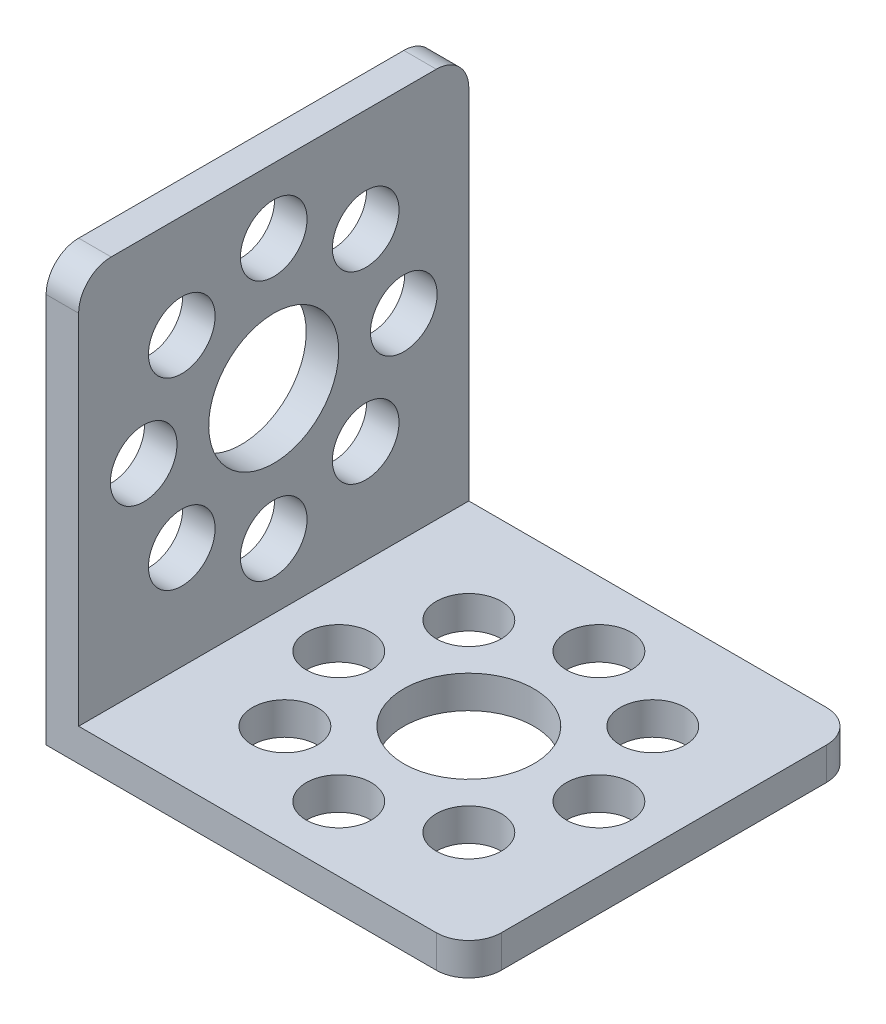
ISO-10303-21;
HEADER;
FILE_DESCRIPTION(('STEP AP214'),'2;1');
FILE_NAME('part.step','',(''),(''),'','','');
FILE_SCHEMA(('AUTOMOTIVE_DESIGN { 1 0 10303 214 1 1 1 1 }'));
ENDSEC;
DATA;
#1=APPLICATION_CONTEXT('core data for automotive mechanical design processes');
#2=APPLICATION_PROTOCOL_DEFINITION('international standard','automotive_design',2000,#1);
#3=PRODUCT_CONTEXT('',#1,'mechanical');
#4=PRODUCT('Part','Part','',(#3));
#5=PRODUCT_RELATED_PRODUCT_CATEGORY('part','',(#4));
#6=PRODUCT_DEFINITION_FORMATION('','',#4);
#7=PRODUCT_DEFINITION_CONTEXT('part definition',#1,'design');
#8=PRODUCT_DEFINITION('design','',#6,#7);
#9=PRODUCT_DEFINITION_SHAPE('','',#8);
#10=(LENGTH_UNIT() NAMED_UNIT(*) SI_UNIT(.MILLI.,.METRE.));
#11=(NAMED_UNIT(*) PLANE_ANGLE_UNIT() SI_UNIT($,.RADIAN.));
#12=(NAMED_UNIT(*) SI_UNIT($,.STERADIAN.) SOLID_ANGLE_UNIT());
#13=UNCERTAINTY_MEASURE_WITH_UNIT(LENGTH_MEASURE(1.E-05),#10,'distance_accuracy_value','');
#14=(GEOMETRIC_REPRESENTATION_CONTEXT(3) GLOBAL_UNCERTAINTY_ASSIGNED_CONTEXT((#13)) GLOBAL_UNIT_ASSIGNED_CONTEXT((#10,
#11,#12)) REPRESENTATION_CONTEXT('',''));
#15=CARTESIAN_POINT('',(0.,0.,0.));
#16=DIRECTION('',(0.,0.,1.));
#17=DIRECTION('',(1.,0.,0.));
#18=AXIS2_PLACEMENT_3D('',#15,#16,#17);
#19=CARTESIAN_POINT('',(26.,0.,24.));
#20=DIRECTION('',(0.,1.,0.));
#21=DIRECTION('',(-1.,0.,0.));
#22=AXIS2_PLACEMENT_3D('',#19,#20,#21);
#23=PLANE('',#22);
#24=CARTESIAN_POINT('',(19.6568542494924,0.,6.34314575050769));
#25=DIRECTION('',(0.,1.,0.));
#26=DIRECTION('',(0.,0.,1.));
#27=AXIS2_PLACEMENT_3D('',#24,#25,#26);
#28=CIRCLE('',#27,2.);
#29=CARTESIAN_POINT('',(19.6568542494924,0.,8.34314575050769));
#30=VERTEX_POINT('',#29);
#31=EDGE_CURVE('E345',#30,#30,#28,.T.);
#32=ORIENTED_EDGE('',*,*,#31,.T.);
#33=EDGE_LOOP('',(#32));
#34=FACE_BOUND('',#33,.T.);
#35=CARTESIAN_POINT('',(14.0000000000001,0.,4.));
#36=DIRECTION('',(0.,1.,0.));
#37=DIRECTION('',(0.,0.,1.));
#38=AXIS2_PLACEMENT_3D('',#35,#36,#37);
#39=CIRCLE('',#38,2.);
#40=CARTESIAN_POINT('',(14.0000000000001,0.,6.));
#41=VERTEX_POINT('',#40);
#42=EDGE_CURVE('E339',#41,#41,#39,.T.);
#43=ORIENTED_EDGE('',*,*,#42,.T.);
#44=EDGE_LOOP('',(#43));
#45=FACE_BOUND('',#44,.T.);
#46=CARTESIAN_POINT('',(8.34314575050767,0.,6.34314575050757));
#47=DIRECTION('',(0.,1.,0.));
#48=DIRECTION('',(0.,0.,1.));
#49=AXIS2_PLACEMENT_3D('',#46,#47,#48);
#50=CIRCLE('',#49,2.);
#51=CARTESIAN_POINT('',(8.34314575050767,0.,8.34314575050757));
#52=VERTEX_POINT('',#51);
#53=EDGE_CURVE('E329',#52,#52,#50,.T.);
#54=ORIENTED_EDGE('',*,*,#53,.T.);
#55=EDGE_LOOP('',(#54));
#56=FACE_BOUND('',#55,.T.);
#57=CARTESIAN_POINT('',(6.,0.,12.));
#58=DIRECTION('',(0.,1.,0.));
#59=DIRECTION('',(0.,0.,1.));
#60=AXIS2_PLACEMENT_3D('',#57,#58,#59);
#61=CIRCLE('',#60,1.99999999999998);
#62=CARTESIAN_POINT('',(6.,0.,14.));
#63=VERTEX_POINT('',#62);
#64=EDGE_CURVE('E324',#63,#63,#61,.T.);
#65=ORIENTED_EDGE('',*,*,#64,.T.);
#66=EDGE_LOOP('',(#65));
#67=FACE_BOUND('',#66,.T.);
#68=CARTESIAN_POINT('',(8.34314575050759,0.,17.6568542494923));
#69=DIRECTION('',(0.,1.,0.));
#70=DIRECTION('',(0.,0.,1.));
#71=AXIS2_PLACEMENT_3D('',#68,#69,#70);
#72=CIRCLE('',#71,2.);
#73=CARTESIAN_POINT('',(8.34314575050759,0.,19.6568542494923));
#74=VERTEX_POINT('',#73);
#75=EDGE_CURVE('E369',#74,#74,#72,.T.);
#76=ORIENTED_EDGE('',*,*,#75,.T.);
#77=EDGE_LOOP('',(#76));
#78=FACE_BOUND('',#77,.T.);
#79=CARTESIAN_POINT('',(14.,0.,20.));
#80=DIRECTION('',(0.,1.,0.));
#81=DIRECTION('',(0.,0.,1.));
#82=AXIS2_PLACEMENT_3D('',#79,#80,#81);
#83=CIRCLE('',#82,2.);
#84=CARTESIAN_POINT('',(14.,0.,22.));
#85=VERTEX_POINT('',#84);
#86=EDGE_CURVE('E363',#85,#85,#83,.T.);
#87=ORIENTED_EDGE('',*,*,#86,.T.);
#88=EDGE_LOOP('',(#87));
#89=FACE_BOUND('',#88,.T.);
#90=CARTESIAN_POINT('',(19.6568542494924,0.,17.6568542494924));
#91=DIRECTION('',(0.,1.,0.));
#92=DIRECTION('',(0.,0.,1.));
#93=AXIS2_PLACEMENT_3D('',#90,#91,#92);
#94=CIRCLE('',#93,2.);
#95=CARTESIAN_POINT('',(19.6568542494924,0.,19.6568542494924));
#96=VERTEX_POINT('',#95);
#97=EDGE_CURVE('E357',#96,#96,#94,.T.);
#98=ORIENTED_EDGE('',*,*,#97,.T.);
#99=EDGE_LOOP('',(#98));
#100=FACE_BOUND('',#99,.T.);
#101=CARTESIAN_POINT('',(22.,0.,12.));
#102=DIRECTION('',(0.,1.,0.));
#103=DIRECTION('',(0.,0.,1.));
#104=AXIS2_PLACEMENT_3D('',#101,#102,#103);
#105=CIRCLE('',#104,2.);
#106=CARTESIAN_POINT('',(22.,0.,14.));
#107=VERTEX_POINT('',#106);
#108=EDGE_CURVE('E350',#107,#107,#105,.T.);
#109=ORIENTED_EDGE('',*,*,#108,.T.);
#110=EDGE_LOOP('',(#109));
#111=FACE_BOUND('',#110,.T.);
#112=CARTESIAN_POINT('',(14.,0.,12.));
#113=DIRECTION('',(0.,1.,0.));
#114=DIRECTION('',(0.,0.,1.));
#115=AXIS2_PLACEMENT_3D('',#112,#113,#114);
#116=CIRCLE('',#115,4.);
#117=CARTESIAN_POINT('',(14.,0.,16.));
#118=VERTEX_POINT('',#117);
#119=EDGE_CURVE('E374',#118,#118,#116,.T.);
#120=ORIENTED_EDGE('',*,*,#119,.T.);
#121=EDGE_LOOP('',(#120));
#122=FACE_BOUND('',#121,.T.);
#123=DIRECTION('',(1.,0.,0.));
#124=VECTOR('',#123,1.);
#125=CARTESIAN_POINT('',(26.,0.,0.));
#126=LINE('',#125,#124);
#127=CARTESIAN_POINT('',(0.,0.,0.));
#128=VERTEX_POINT('',#127);
#129=CARTESIAN_POINT('',(24.,0.,0.));
#130=VERTEX_POINT('',#129);
#131=EDGE_CURVE('E146',#128,#130,#126,.T.);
#132=ORIENTED_EDGE('',*,*,#131,.T.);
#133=CARTESIAN_POINT('',(24.,0.,2.));
#134=DIRECTION('',(0.,1.,0.));
#135=DIRECTION('',(-1.,0.,0.));
#136=AXIS2_PLACEMENT_3D('',#133,#134,#135);
#137=CIRCLE('',#136,2.);
#138=CARTESIAN_POINT('',(26.,0.,2.));
#139=VERTEX_POINT('',#138);
#140=EDGE_CURVE('E11',#130,#139,#137,.F.);
#141=ORIENTED_EDGE('',*,*,#140,.T.);
#142=DIRECTION('',(0.,0.,-1.));
#143=VECTOR('',#142,1.);
#144=CARTESIAN_POINT('',(26.,0.,24.));
#145=LINE('',#144,#143);
#146=CARTESIAN_POINT('',(26.,0.,22.));
#147=VERTEX_POINT('',#146);
#148=EDGE_CURVE('E162',#147,#139,#145,.T.);
#149=ORIENTED_EDGE('',*,*,#148,.F.);
#150=CARTESIAN_POINT('',(24.,0.,22.));
#151=DIRECTION('',(0.,1.,0.));
#152=DIRECTION('',(-1.,0.,0.));
#153=AXIS2_PLACEMENT_3D('',#150,#151,#152);
#154=CIRCLE('',#153,2.);
#155=CARTESIAN_POINT('',(24.,0.,24.));
#156=VERTEX_POINT('',#155);
#157=EDGE_CURVE('E41',#147,#156,#154,.F.);
#158=ORIENTED_EDGE('',*,*,#157,.T.);
#159=DIRECTION('',(1.,0.,0.));
#160=VECTOR('',#159,1.);
#161=CARTESIAN_POINT('',(26.,0.,24.));
#162=LINE('',#161,#160);
#163=CARTESIAN_POINT('',(0.,0.,24.));
#164=VERTEX_POINT('',#163);
#165=EDGE_CURVE('E122',#164,#156,#162,.T.);
#166=ORIENTED_EDGE('',*,*,#165,.F.);
#167=DIRECTION('',(0.,0.,-1.));
#168=VECTOR('',#167,1.);
#169=CARTESIAN_POINT('',(0.,0.,24.));
#170=LINE('',#169,#168);
#171=EDGE_CURVE('E142',#164,#128,#170,.T.);
#172=ORIENTED_EDGE('',*,*,#171,.T.);
#173=EDGE_LOOP('',(#132,#141,#149,#158,#166,#172));
#174=FACE_BOUND('',#173,.T.);
#175=ADVANCED_FACE('F33',(#34,#45,#56,#67,#78,#89,#100,#111,#122,#174),#23,.F.);
#176=CARTESIAN_POINT('',(26.,2.,24.));
#177=DIRECTION('',(-1.,0.,0.));
#178=DIRECTION('',(0.,0.,1.));
#179=AXIS2_PLACEMENT_3D('',#176,#177,#178);
#180=PLANE('',#179);
#181=ORIENTED_EDGE('',*,*,#148,.T.);
#182=DIRECTION('',(0.,1.,0.));
#183=VECTOR('',#182,1.);
#184=CARTESIAN_POINT('',(26.,2.,2.));
#185=LINE('',#184,#183);
#186=CARTESIAN_POINT('',(26.,2.,2.));
#187=VERTEX_POINT('',#186);
#188=EDGE_CURVE('E184',#139,#187,#185,.T.);
#189=ORIENTED_EDGE('',*,*,#188,.T.);
#190=DIRECTION('',(0.,0.,-1.));
#191=VECTOR('',#190,1.);
#192=CARTESIAN_POINT('',(26.,2.,24.));
#193=LINE('',#192,#191);
#194=CARTESIAN_POINT('',(26.,2.,22.));
#195=VERTEX_POINT('',#194);
#196=EDGE_CURVE('E133',#195,#187,#193,.T.);
#197=ORIENTED_EDGE('',*,*,#196,.F.);
#198=DIRECTION('',(0.,1.,0.));
#199=VECTOR('',#198,1.);
#200=CARTESIAN_POINT('',(26.,2.,22.));
#201=LINE('',#200,#199);
#202=EDGE_CURVE('E53',#195,#147,#201,.F.);
#203=ORIENTED_EDGE('',*,*,#202,.T.);
#204=EDGE_LOOP('',(#181,#189,#197,#203));
#205=FACE_BOUND('',#204,.T.);
#206=ADVANCED_FACE('F195',(#205),#180,.F.);
#207=CARTESIAN_POINT('',(2.,2.,24.));
#208=DIRECTION('',(0.,-1.,0.));
#209=DIRECTION('',(0.,0.,-1.));
#210=AXIS2_PLACEMENT_3D('',#207,#208,#209);
#211=PLANE('',#210);
#212=CARTESIAN_POINT('',(19.6568542494924,2.,6.34314575050769));
#213=DIRECTION('',(0.,1.,0.));
#214=DIRECTION('',(0.,0.,1.));
#215=AXIS2_PLACEMENT_3D('',#212,#213,#214);
#216=CIRCLE('',#215,2.);
#217=CARTESIAN_POINT('',(19.6568542494924,2.,8.34314575050769));
#218=VERTEX_POINT('',#217);
#219=EDGE_CURVE('E347',#218,#218,#216,.T.);
#220=ORIENTED_EDGE('',*,*,#219,.F.);
#221=EDGE_LOOP('',(#220));
#222=FACE_BOUND('',#221,.T.);
#223=CARTESIAN_POINT('',(14.0000000000001,2.,4.));
#224=DIRECTION('',(0.,1.,0.));
#225=DIRECTION('',(0.,0.,1.));
#226=AXIS2_PLACEMENT_3D('',#223,#224,#225);
#227=CIRCLE('',#226,2.);
#228=CARTESIAN_POINT('',(14.0000000000001,2.,6.));
#229=VERTEX_POINT('',#228);
#230=EDGE_CURVE('E342',#229,#229,#227,.T.);
#231=ORIENTED_EDGE('',*,*,#230,.F.);
#232=EDGE_LOOP('',(#231));
#233=FACE_BOUND('',#232,.T.);
#234=CARTESIAN_POINT('',(8.34314575050767,2.,6.34314575050757));
#235=DIRECTION('',(0.,1.,0.));
#236=DIRECTION('',(0.,0.,1.));
#237=AXIS2_PLACEMENT_3D('',#234,#235,#236);
#238=CIRCLE('',#237,2.);
#239=CARTESIAN_POINT('',(8.34314575050767,2.,8.34314575050757));
#240=VERTEX_POINT('',#239);
#241=EDGE_CURVE('E334',#240,#240,#238,.T.);
#242=ORIENTED_EDGE('',*,*,#241,.F.);
#243=EDGE_LOOP('',(#242));
#244=FACE_BOUND('',#243,.T.);
#245=CARTESIAN_POINT('',(6.,2.,12.));
#246=DIRECTION('',(0.,1.,0.));
#247=DIRECTION('',(0.,0.,1.));
#248=AXIS2_PLACEMENT_3D('',#245,#246,#247);
#249=CIRCLE('',#248,1.99999999999998);
#250=CARTESIAN_POINT('',(6.,2.,14.));
#251=VERTEX_POINT('',#250);
#252=EDGE_CURVE('E327',#251,#251,#249,.T.);
#253=ORIENTED_EDGE('',*,*,#252,.F.);
#254=EDGE_LOOP('',(#253));
#255=FACE_BOUND('',#254,.T.);
#256=CARTESIAN_POINT('',(8.34314575050759,2.,17.6568542494923));
#257=DIRECTION('',(0.,1.,0.));
#258=DIRECTION('',(0.,0.,1.));
#259=AXIS2_PLACEMENT_3D('',#256,#257,#258);
#260=CIRCLE('',#259,2.);
#261=CARTESIAN_POINT('',(8.34314575050759,2.,19.6568542494923));
#262=VERTEX_POINT('',#261);
#263=EDGE_CURVE('E331',#262,#262,#260,.T.);
#264=ORIENTED_EDGE('',*,*,#263,.F.);
#265=EDGE_LOOP('',(#264));
#266=FACE_BOUND('',#265,.T.);
#267=CARTESIAN_POINT('',(14.,2.,20.));
#268=DIRECTION('',(0.,1.,0.));
#269=DIRECTION('',(0.,0.,1.));
#270=AXIS2_PLACEMENT_3D('',#267,#268,#269);
#271=CIRCLE('',#270,2.);
#272=CARTESIAN_POINT('',(14.,2.,22.));
#273=VERTEX_POINT('',#272);
#274=EDGE_CURVE('E366',#273,#273,#271,.T.);
#275=ORIENTED_EDGE('',*,*,#274,.F.);
#276=EDGE_LOOP('',(#275));
#277=FACE_BOUND('',#276,.T.);
#278=CARTESIAN_POINT('',(19.6568542494924,2.,17.6568542494924));
#279=DIRECTION('',(0.,1.,0.));
#280=DIRECTION('',(0.,0.,1.));
#281=AXIS2_PLACEMENT_3D('',#278,#279,#280);
#282=CIRCLE('',#281,2.);
#283=CARTESIAN_POINT('',(19.6568542494924,2.,19.6568542494924));
#284=VERTEX_POINT('',#283);
#285=EDGE_CURVE('E360',#284,#284,#282,.T.);
#286=ORIENTED_EDGE('',*,*,#285,.F.);
#287=EDGE_LOOP('',(#286));
#288=FACE_BOUND('',#287,.T.);
#289=CARTESIAN_POINT('',(22.,2.,12.));
#290=DIRECTION('',(0.,1.,0.));
#291=DIRECTION('',(0.,0.,1.));
#292=AXIS2_PLACEMENT_3D('',#289,#290,#291);
#293=CIRCLE('',#292,2.);
#294=CARTESIAN_POINT('',(22.,2.,14.));
#295=VERTEX_POINT('',#294);
#296=EDGE_CURVE('E354',#295,#295,#293,.T.);
#297=ORIENTED_EDGE('',*,*,#296,.F.);
#298=EDGE_LOOP('',(#297));
#299=FACE_BOUND('',#298,.T.);
#300=CARTESIAN_POINT('',(14.,2.,12.));
#301=DIRECTION('',(0.,1.,0.));
#302=DIRECTION('',(0.,0.,1.));
#303=AXIS2_PLACEMENT_3D('',#300,#301,#302);
#304=CIRCLE('',#303,4.);
#305=CARTESIAN_POINT('',(14.,2.,16.));
#306=VERTEX_POINT('',#305);
#307=EDGE_CURVE('E353',#306,#306,#304,.T.);
#308=ORIENTED_EDGE('',*,*,#307,.F.);
#309=EDGE_LOOP('',(#308));
#310=FACE_BOUND('',#309,.T.);
#311=ORIENTED_EDGE('',*,*,#196,.T.);
#312=CARTESIAN_POINT('',(24.,2.,2.));
#313=DIRECTION('',(0.,-1.,0.));
#314=DIRECTION('',(0.,0.,-1.));
#315=AXIS2_PLACEMENT_3D('',#312,#313,#314);
#316=CIRCLE('',#315,2.);
#317=CARTESIAN_POINT('',(24.,2.,0.));
#318=VERTEX_POINT('',#317);
#319=EDGE_CURVE('E189',#187,#318,#316,.F.);
#320=ORIENTED_EDGE('',*,*,#319,.T.);
#321=DIRECTION('',(-1.,0.,0.));
#322=VECTOR('',#321,1.);
#323=CARTESIAN_POINT('',(2.,2.,0.));
#324=LINE('',#323,#322);
#325=CARTESIAN_POINT('',(2.,2.,0.));
#326=VERTEX_POINT('',#325);
#327=EDGE_CURVE('E129',#318,#326,#324,.T.);
#328=ORIENTED_EDGE('',*,*,#327,.T.);
#329=DIRECTION('',(0.,0.,-1.));
#330=VECTOR('',#329,1.);
#331=CARTESIAN_POINT('',(2.,2.,24.));
#332=LINE('',#331,#330);
#333=CARTESIAN_POINT('',(2.,2.,24.));
#334=VERTEX_POINT('',#333);
#335=EDGE_CURVE('E125',#334,#326,#332,.T.);
#336=ORIENTED_EDGE('',*,*,#335,.F.);
#337=DIRECTION('',(-1.,0.,0.));
#338=VECTOR('',#337,1.);
#339=CARTESIAN_POINT('',(2.,2.,24.));
#340=LINE('',#339,#338);
#341=CARTESIAN_POINT('',(24.,2.,24.));
#342=VERTEX_POINT('',#341);
#343=EDGE_CURVE('E111',#342,#334,#340,.T.);
#344=ORIENTED_EDGE('',*,*,#343,.F.);
#345=CARTESIAN_POINT('',(24.,2.,22.));
#346=DIRECTION('',(0.,-1.,0.));
#347=DIRECTION('',(0.,0.,-1.));
#348=AXIS2_PLACEMENT_3D('',#345,#346,#347);
#349=CIRCLE('',#348,2.);
#350=EDGE_CURVE('E187',#342,#195,#349,.F.);
#351=ORIENTED_EDGE('',*,*,#350,.T.);
#352=EDGE_LOOP('',(#311,#320,#328,#336,#344,#351));
#353=FACE_BOUND('',#352,.T.);
#354=ADVANCED_FACE('F127',(#222,#233,#244,#255,#266,#277,#288,#299,#310,#353),#211,.F.);
#355=CARTESIAN_POINT('',(2.,26.,24.));
#356=DIRECTION('',(-1.,0.,0.));
#357=DIRECTION('',(0.,-1.,0.));
#358=AXIS2_PLACEMENT_3D('',#355,#356,#357);
#359=PLANE('',#358);
#360=CARTESIAN_POINT('',(2.,19.6568542494924,17.6568542494924));
#361=DIRECTION('',(1.,0.,0.));
#362=DIRECTION('',(0.,1.,0.));
#363=AXIS2_PLACEMENT_3D('',#360,#361,#362);
#364=CIRCLE('',#363,2.05);
#365=CARTESIAN_POINT('',(2.,21.7068542494924,17.6568542494924));
#366=VERTEX_POINT('',#365);
#367=EDGE_CURVE('E377',#366,#366,#364,.T.);
#368=ORIENTED_EDGE('',*,*,#367,.F.);
#369=EDGE_LOOP('',(#368));
#370=FACE_BOUND('',#369,.T.);
#371=CARTESIAN_POINT('',(2.,14.,20.));
#372=DIRECTION('',(1.,0.,0.));
#373=DIRECTION('',(0.,1.,0.));
#374=AXIS2_PLACEMENT_3D('',#371,#372,#373);
#375=CIRCLE('',#374,2.05);
#376=CARTESIAN_POINT('',(2.,16.05,20.));
#377=VERTEX_POINT('',#376);
#378=EDGE_CURVE('E396',#377,#377,#375,.T.);
#379=ORIENTED_EDGE('',*,*,#378,.F.);
#380=EDGE_LOOP('',(#379));
#381=FACE_BOUND('',#380,.T.);
#382=CARTESIAN_POINT('',(2.,8.34314575050761,17.6568542494924));
#383=DIRECTION('',(1.,0.,0.));
#384=DIRECTION('',(0.,1.,0.));
#385=AXIS2_PLACEMENT_3D('',#382,#383,#384);
#386=CIRCLE('',#385,2.05);
#387=CARTESIAN_POINT('',(2.,10.3931457505076,17.6568542494924));
#388=VERTEX_POINT('',#387);
#389=EDGE_CURVE('E390',#388,#388,#386,.T.);
#390=ORIENTED_EDGE('',*,*,#389,.F.);
#391=EDGE_LOOP('',(#390));
#392=FACE_BOUND('',#391,.T.);
#393=CARTESIAN_POINT('',(2.,6.,12.));
#394=DIRECTION('',(1.,0.,0.));
#395=DIRECTION('',(0.,1.,0.));
#396=AXIS2_PLACEMENT_3D('',#393,#394,#395);
#397=CIRCLE('',#396,2.05);
#398=CARTESIAN_POINT('',(2.,8.05,12.));
#399=VERTEX_POINT('',#398);
#400=EDGE_CURVE('E384',#399,#399,#397,.T.);
#401=ORIENTED_EDGE('',*,*,#400,.F.);
#402=EDGE_LOOP('',(#401));
#403=FACE_BOUND('',#402,.T.);
#404=CARTESIAN_POINT('',(2.,19.6568542494924,6.34314575050762));
#405=DIRECTION('',(1.,0.,0.));
#406=DIRECTION('',(0.,1.,0.));
#407=AXIS2_PLACEMENT_3D('',#404,#405,#406);
#408=CIRCLE('',#407,2.05);
#409=CARTESIAN_POINT('',(2.,21.7068542494924,6.34314575050762));
#410=VERTEX_POINT('',#409);
#411=EDGE_CURVE('E407',#410,#410,#408,.T.);
#412=ORIENTED_EDGE('',*,*,#411,.F.);
#413=EDGE_LOOP('',(#412));
#414=FACE_BOUND('',#413,.T.);
#415=CARTESIAN_POINT('',(2.,14.,12.));
#416=DIRECTION('',(1.,0.,0.));
#417=DIRECTION('',(0.,1.,0.));
#418=AXIS2_PLACEMENT_3D('',#415,#416,#417);
#419=CIRCLE('',#418,4.);
#420=CARTESIAN_POINT('',(2.,18.,12.));
#421=VERTEX_POINT('',#420);
#422=EDGE_CURVE('E419',#421,#421,#419,.T.);
#423=ORIENTED_EDGE('',*,*,#422,.F.);
#424=EDGE_LOOP('',(#423));
#425=FACE_BOUND('',#424,.T.);
#426=CARTESIAN_POINT('',(2.,14.,4.));
#427=DIRECTION('',(1.,0.,0.));
#428=DIRECTION('',(0.,1.,0.));
#429=AXIS2_PLACEMENT_3D('',#426,#427,#428);
#430=CIRCLE('',#429,2.05);
#431=CARTESIAN_POINT('',(2.,16.05,4.));
#432=VERTEX_POINT('',#431);
#433=EDGE_CURVE('E408',#432,#432,#430,.T.);
#434=ORIENTED_EDGE('',*,*,#433,.F.);
#435=EDGE_LOOP('',(#434));
#436=FACE_BOUND('',#435,.T.);
#437=CARTESIAN_POINT('',(2.,8.34314575050762,6.34314575050762));
#438=DIRECTION('',(1.,0.,0.));
#439=DIRECTION('',(0.,1.,0.));
#440=AXIS2_PLACEMENT_3D('',#437,#438,#439);
#441=CIRCLE('',#440,2.05);
#442=CARTESIAN_POINT('',(2.,10.3931457505076,6.34314575050762));
#443=VERTEX_POINT('',#442);
#444=EDGE_CURVE('E383',#443,#443,#441,.T.);
#445=ORIENTED_EDGE('',*,*,#444,.F.);
#446=EDGE_LOOP('',(#445));
#447=FACE_BOUND('',#446,.T.);
#448=CARTESIAN_POINT('',(2.,22.,12.));
#449=DIRECTION('',(1.,0.,0.));
#450=DIRECTION('',(0.,1.,0.));
#451=AXIS2_PLACEMENT_3D('',#448,#449,#450);
#452=CIRCLE('',#451,2.05);
#453=CARTESIAN_POINT('',(2.,24.05,12.));
#454=VERTEX_POINT('',#453);
#455=EDGE_CURVE('E425',#454,#454,#452,.T.);
#456=ORIENTED_EDGE('',*,*,#455,.F.);
#457=EDGE_LOOP('',(#456));
#458=FACE_BOUND('',#457,.T.);
#459=DIRECTION('',(0.,0.,-1.));
#460=VECTOR('',#459,1.);
#461=CARTESIAN_POINT('',(2.,26.,24.));
#462=LINE('',#461,#460);
#463=CARTESIAN_POINT('',(2.,26.,22.));
#464=VERTEX_POINT('',#463);
#465=CARTESIAN_POINT('',(2.,26.,2.));
#466=VERTEX_POINT('',#465);
#467=EDGE_CURVE('E134',#464,#466,#462,.T.);
#468=ORIENTED_EDGE('',*,*,#467,.F.);
#469=CARTESIAN_POINT('',(2.,24.,22.));
#470=DIRECTION('',(-1.,0.,0.));
#471=DIRECTION('',(0.,-1.,0.));
#472=AXIS2_PLACEMENT_3D('',#469,#470,#471);
#473=CIRCLE('',#472,2.);
#474=CARTESIAN_POINT('',(2.,24.,24.));
#475=VERTEX_POINT('',#474);
#476=EDGE_CURVE('E139',#464,#475,#473,.F.);
#477=ORIENTED_EDGE('',*,*,#476,.T.);
#478=DIRECTION('',(0.,1.,0.));
#479=VECTOR('',#478,1.);
#480=CARTESIAN_POINT('',(2.,26.,24.));
#481=LINE('',#480,#479);
#482=EDGE_CURVE('E116',#334,#475,#481,.T.);
#483=ORIENTED_EDGE('',*,*,#482,.F.);
#484=ORIENTED_EDGE('',*,*,#335,.T.);
#485=DIRECTION('',(0.,1.,0.));
#486=VECTOR('',#485,1.);
#487=CARTESIAN_POINT('',(2.,26.,0.));
#488=LINE('',#487,#486);
#489=CARTESIAN_POINT('',(2.,24.,0.));
#490=VERTEX_POINT('',#489);
#491=EDGE_CURVE('E150',#326,#490,#488,.T.);
#492=ORIENTED_EDGE('',*,*,#491,.T.);
#493=CARTESIAN_POINT('',(2.,24.,2.));
#494=DIRECTION('',(-1.,0.,0.));
#495=DIRECTION('',(0.,-1.,0.));
#496=AXIS2_PLACEMENT_3D('',#493,#494,#495);
#497=CIRCLE('',#496,2.);
#498=EDGE_CURVE('E176',#490,#466,#497,.F.);
#499=ORIENTED_EDGE('',*,*,#498,.T.);
#500=EDGE_LOOP('',(#468,#477,#483,#484,#492,#499));
#501=FACE_BOUND('',#500,.T.);
#502=ADVANCED_FACE('F137',(#370,#381,#392,#403,#414,#425,#436,#447,#458,#501),#359,.F.);
#503=CARTESIAN_POINT('',(0.,26.,24.));
#504=DIRECTION('',(0.,-1.,0.));
#505=DIRECTION('',(0.,0.,-1.));
#506=AXIS2_PLACEMENT_3D('',#503,#504,#505);
#507=PLANE('',#506);
#508=DIRECTION('',(0.,0.,-1.));
#509=VECTOR('',#508,1.);
#510=CARTESIAN_POINT('',(0.,26.,24.));
#511=LINE('',#510,#509);
#512=CARTESIAN_POINT('',(0.,26.,22.));
#513=VERTEX_POINT('',#512);
#514=CARTESIAN_POINT('',(0.,26.,2.));
#515=VERTEX_POINT('',#514);
#516=EDGE_CURVE('E156',#513,#515,#511,.T.);
#517=ORIENTED_EDGE('',*,*,#516,.F.);
#518=DIRECTION('',(-1.,0.,0.));
#519=VECTOR('',#518,1.);
#520=CARTESIAN_POINT('',(0.,26.,22.));
#521=LINE('',#520,#519);
#522=EDGE_CURVE('E174',#513,#464,#521,.F.);
#523=ORIENTED_EDGE('',*,*,#522,.T.);
#524=ORIENTED_EDGE('',*,*,#467,.T.);
#525=DIRECTION('',(-1.,0.,0.));
#526=VECTOR('',#525,1.);
#527=CARTESIAN_POINT('',(0.,26.,2.));
#528=LINE('',#527,#526);
#529=EDGE_CURVE('E171',#466,#515,#528,.T.);
#530=ORIENTED_EDGE('',*,*,#529,.T.);
#531=EDGE_LOOP('',(#517,#523,#524,#530));
#532=FACE_BOUND('',#531,.T.);
#533=ADVANCED_FACE('F211',(#532),#507,.F.);
#534=CARTESIAN_POINT('',(0.,0.,24.));
#535=DIRECTION('',(1.,0.,0.));
#536=DIRECTION('',(0.,0.,-1.));
#537=AXIS2_PLACEMENT_3D('',#534,#535,#536);
#538=PLANE('',#537);
#539=CARTESIAN_POINT('',(0.,19.6568542494924,17.6568542494924));
#540=DIRECTION('',(1.,0.,0.));
#541=DIRECTION('',(0.,1.,0.));
#542=AXIS2_PLACEMENT_3D('',#539,#540,#541);
#543=CIRCLE('',#542,2.05);
#544=CARTESIAN_POINT('',(0.,21.7068542494924,17.6568542494924));
#545=VERTEX_POINT('',#544);
#546=EDGE_CURVE('E399',#545,#545,#543,.T.);
#547=ORIENTED_EDGE('',*,*,#546,.T.);
#548=EDGE_LOOP('',(#547));
#549=FACE_BOUND('',#548,.T.);
#550=CARTESIAN_POINT('',(0.,14.,20.));
#551=DIRECTION('',(1.,0.,0.));
#552=DIRECTION('',(0.,1.,0.));
#553=AXIS2_PLACEMENT_3D('',#550,#551,#552);
#554=CIRCLE('',#553,2.05);
#555=CARTESIAN_POINT('',(0.,16.05,20.));
#556=VERTEX_POINT('',#555);
#557=EDGE_CURVE('E393',#556,#556,#554,.T.);
#558=ORIENTED_EDGE('',*,*,#557,.T.);
#559=EDGE_LOOP('',(#558));
#560=FACE_BOUND('',#559,.T.);
#561=CARTESIAN_POINT('',(0.,8.34314575050761,17.6568542494924));
#562=DIRECTION('',(1.,0.,0.));
#563=DIRECTION('',(0.,1.,0.));
#564=AXIS2_PLACEMENT_3D('',#561,#562,#563);
#565=CIRCLE('',#564,2.05);
#566=CARTESIAN_POINT('',(0.,10.3931457505076,17.6568542494924));
#567=VERTEX_POINT('',#566);
#568=EDGE_CURVE('E387',#567,#567,#565,.T.);
#569=ORIENTED_EDGE('',*,*,#568,.T.);
#570=EDGE_LOOP('',(#569));
#571=FACE_BOUND('',#570,.T.);
#572=CARTESIAN_POINT('',(0.,6.,12.));
#573=DIRECTION('',(1.,0.,0.));
#574=DIRECTION('',(0.,1.,0.));
#575=AXIS2_PLACEMENT_3D('',#572,#573,#574);
#576=CIRCLE('',#575,2.05);
#577=CARTESIAN_POINT('',(0.,8.05,12.));
#578=VERTEX_POINT('',#577);
#579=EDGE_CURVE('E380',#578,#578,#576,.T.);
#580=ORIENTED_EDGE('',*,*,#579,.T.);
#581=EDGE_LOOP('',(#580));
#582=FACE_BOUND('',#581,.T.);
#583=CARTESIAN_POINT('',(0.,19.6568542494924,6.34314575050762));
#584=DIRECTION('',(1.,0.,0.));
#585=DIRECTION('',(0.,1.,0.));
#586=AXIS2_PLACEMENT_3D('',#583,#584,#585);
#587=CIRCLE('',#586,2.05);
#588=CARTESIAN_POINT('',(0.,21.7068542494924,6.34314575050762));
#589=VERTEX_POINT('',#588);
#590=EDGE_CURVE('E416',#589,#589,#587,.T.);
#591=ORIENTED_EDGE('',*,*,#590,.T.);
#592=EDGE_LOOP('',(#591));
#593=FACE_BOUND('',#592,.T.);
#594=CARTESIAN_POINT('',(0.,14.,12.));
#595=DIRECTION('',(1.,0.,0.));
#596=DIRECTION('',(0.,1.,0.));
#597=AXIS2_PLACEMENT_3D('',#594,#595,#596);
#598=CIRCLE('',#597,4.);
#599=CARTESIAN_POINT('',(0.,18.,12.));
#600=VERTEX_POINT('',#599);
#601=EDGE_CURVE('E422',#600,#600,#598,.T.);
#602=ORIENTED_EDGE('',*,*,#601,.T.);
#603=EDGE_LOOP('',(#602));
#604=FACE_BOUND('',#603,.T.);
#605=CARTESIAN_POINT('',(0.,14.,4.));
#606=DIRECTION('',(1.,0.,0.));
#607=DIRECTION('',(0.,1.,0.));
#608=AXIS2_PLACEMENT_3D('',#605,#606,#607);
#609=CIRCLE('',#608,2.05);
#610=CARTESIAN_POINT('',(0.,16.05,4.));
#611=VERTEX_POINT('',#610);
#612=EDGE_CURVE('E404',#611,#611,#609,.T.);
#613=ORIENTED_EDGE('',*,*,#612,.T.);
#614=EDGE_LOOP('',(#613));
#615=FACE_BOUND('',#614,.T.);
#616=CARTESIAN_POINT('',(0.,8.34314575050762,6.34314575050762));
#617=DIRECTION('',(1.,0.,0.));
#618=DIRECTION('',(0.,1.,0.));
#619=AXIS2_PLACEMENT_3D('',#616,#617,#618);
#620=CIRCLE('',#619,2.05);
#621=CARTESIAN_POINT('',(0.,10.3931457505076,6.34314575050762));
#622=VERTEX_POINT('',#621);
#623=EDGE_CURVE('E411',#622,#622,#620,.T.);
#624=ORIENTED_EDGE('',*,*,#623,.T.);
#625=EDGE_LOOP('',(#624));
#626=FACE_BOUND('',#625,.T.);
#627=CARTESIAN_POINT('',(0.,22.,12.));
#628=DIRECTION('',(1.,0.,0.));
#629=DIRECTION('',(0.,1.,0.));
#630=AXIS2_PLACEMENT_3D('',#627,#628,#629);
#631=CIRCLE('',#630,2.05);
#632=CARTESIAN_POINT('',(0.,24.05,12.));
#633=VERTEX_POINT('',#632);
#634=EDGE_CURVE('E148',#633,#633,#631,.T.);
#635=ORIENTED_EDGE('',*,*,#634,.T.);
#636=EDGE_LOOP('',(#635));
#637=FACE_BOUND('',#636,.T.);
#638=DIRECTION('',(0.,-1.,0.));
#639=VECTOR('',#638,1.);
#640=CARTESIAN_POINT('',(0.,0.,24.));
#641=LINE('',#640,#639);
#642=CARTESIAN_POINT('',(0.,24.,24.));
#643=VERTEX_POINT('',#642);
#644=EDGE_CURVE('E140',#643,#164,#641,.T.);
#645=ORIENTED_EDGE('',*,*,#644,.F.);
#646=CARTESIAN_POINT('',(0.,24.,22.));
#647=DIRECTION('',(1.,0.,0.));
#648=DIRECTION('',(0.,0.,-1.));
#649=AXIS2_PLACEMENT_3D('',#646,#647,#648);
#650=CIRCLE('',#649,2.);
#651=EDGE_CURVE('E169',#643,#513,#650,.F.);
#652=ORIENTED_EDGE('',*,*,#651,.T.);
#653=ORIENTED_EDGE('',*,*,#516,.T.);
#654=CARTESIAN_POINT('',(0.,24.,2.));
#655=DIRECTION('',(1.,0.,0.));
#656=DIRECTION('',(0.,0.,-1.));
#657=AXIS2_PLACEMENT_3D('',#654,#655,#656);
#658=CIRCLE('',#657,2.);
#659=CARTESIAN_POINT('',(0.,24.,0.));
#660=VERTEX_POINT('',#659);
#661=EDGE_CURVE('E167',#515,#660,#658,.F.);
#662=ORIENTED_EDGE('',*,*,#661,.T.);
#663=DIRECTION('',(0.,-1.,0.));
#664=VECTOR('',#663,1.);
#665=CARTESIAN_POINT('',(0.,0.,0.));
#666=LINE('',#665,#664);
#667=EDGE_CURVE('E152',#660,#128,#666,.T.);
#668=ORIENTED_EDGE('',*,*,#667,.T.);
#669=ORIENTED_EDGE('',*,*,#171,.F.);
#670=EDGE_LOOP('',(#645,#652,#653,#662,#668,#669));
#671=FACE_BOUND('',#670,.T.);
#672=ADVANCED_FACE('F214',(#549,#560,#571,#582,#593,#604,#615,#626,#637,#671),#538,.F.);
#673=CARTESIAN_POINT('',(0.,0.,24.));
#674=DIRECTION('',(0.,0.,-1.));
#675=DIRECTION('',(-1.,0.,0.));
#676=AXIS2_PLACEMENT_3D('',#673,#674,#675);
#677=PLANE('',#676);
#678=ORIENTED_EDGE('',*,*,#482,.T.);
#679=DIRECTION('',(-1.,0.,0.));
#680=VECTOR('',#679,1.);
#681=CARTESIAN_POINT('',(0.,24.,24.));
#682=LINE('',#681,#680);
#683=EDGE_CURVE('E165',#475,#643,#682,.T.);
#684=ORIENTED_EDGE('',*,*,#683,.T.);
#685=ORIENTED_EDGE('',*,*,#644,.T.);
#686=ORIENTED_EDGE('',*,*,#165,.T.);
#687=DIRECTION('',(0.,1.,0.));
#688=VECTOR('',#687,1.);
#689=CARTESIAN_POINT('',(24.,0.,24.));
#690=LINE('',#689,#688);
#691=EDGE_CURVE('E120',#156,#342,#690,.T.);
#692=ORIENTED_EDGE('',*,*,#691,.T.);
#693=ORIENTED_EDGE('',*,*,#343,.T.);
#694=EDGE_LOOP('',(#678,#684,#685,#686,#692,#693));
#695=FACE_BOUND('',#694,.T.);
#696=ADVANCED_FACE('F113',(#695),#677,.F.);
#697=CARTESIAN_POINT('',(0.,0.,0.));
#698=DIRECTION('',(0.,0.,-1.));
#699=DIRECTION('',(-1.,0.,0.));
#700=AXIS2_PLACEMENT_3D('',#697,#698,#699);
#701=PLANE('',#700);
#702=ORIENTED_EDGE('',*,*,#667,.F.);
#703=DIRECTION('',(-1.,0.,0.));
#704=VECTOR('',#703,1.);
#705=CARTESIAN_POINT('',(2.,24.,0.));
#706=LINE('',#705,#704);
#707=EDGE_CURVE('E181',#660,#490,#706,.F.);
#708=ORIENTED_EDGE('',*,*,#707,.T.);
#709=ORIENTED_EDGE('',*,*,#491,.F.);
#710=ORIENTED_EDGE('',*,*,#327,.F.);
#711=DIRECTION('',(0.,1.,0.));
#712=VECTOR('',#711,1.);
#713=CARTESIAN_POINT('',(24.,0.,0.));
#714=LINE('',#713,#712);
#715=EDGE_CURVE('E179',#318,#130,#714,.F.);
#716=ORIENTED_EDGE('',*,*,#715,.T.);
#717=ORIENTED_EDGE('',*,*,#131,.F.);
#718=EDGE_LOOP('',(#702,#708,#709,#710,#716,#717));
#719=FACE_BOUND('',#718,.T.);
#720=ADVANCED_FACE('F202',(#719),#701,.T.);
#721=CARTESIAN_POINT('',(0.,22.,12.));
#722=DIRECTION('',(1.,0.,0.));
#723=DIRECTION('',(0.,1.,0.));
#724=AXIS2_PLACEMENT_3D('',#721,#722,#723);
#725=CYLINDRICAL_SURFACE('',#724,2.05);
#726=ORIENTED_EDGE('',*,*,#634,.F.);
#727=EDGE_LOOP('',(#726));
#728=FACE_BOUND('',#727,.T.);
#729=ORIENTED_EDGE('',*,*,#455,.T.);
#730=EDGE_LOOP('',(#729));
#731=FACE_BOUND('',#730,.T.);
#732=ADVANCED_FACE('F251',(#728,#731),#725,.F.);
#733=CARTESIAN_POINT('',(0.,8.34314575050762,6.34314575050762));
#734=DIRECTION('',(1.,0.,0.));
#735=DIRECTION('',(0.,1.,0.));
#736=AXIS2_PLACEMENT_3D('',#733,#734,#735);
#737=CYLINDRICAL_SURFACE('',#736,2.05);
#738=ORIENTED_EDGE('',*,*,#623,.F.);
#739=EDGE_LOOP('',(#738));
#740=FACE_BOUND('',#739,.T.);
#741=ORIENTED_EDGE('',*,*,#444,.T.);
#742=EDGE_LOOP('',(#741));
#743=FACE_BOUND('',#742,.T.);
#744=ADVANCED_FACE('F256',(#740,#743),#737,.F.);
#745=CARTESIAN_POINT('',(0.,14.,4.));
#746=DIRECTION('',(1.,0.,0.));
#747=DIRECTION('',(0.,1.,0.));
#748=AXIS2_PLACEMENT_3D('',#745,#746,#747);
#749=CYLINDRICAL_SURFACE('',#748,2.05);
#750=ORIENTED_EDGE('',*,*,#612,.F.);
#751=EDGE_LOOP('',(#750));
#752=FACE_BOUND('',#751,.T.);
#753=ORIENTED_EDGE('',*,*,#433,.T.);
#754=EDGE_LOOP('',(#753));
#755=FACE_BOUND('',#754,.T.);
#756=ADVANCED_FACE('F262',(#752,#755),#749,.F.);
#757=CARTESIAN_POINT('',(0.,14.,12.));
#758=DIRECTION('',(1.,0.,0.));
#759=DIRECTION('',(0.,1.,0.));
#760=AXIS2_PLACEMENT_3D('',#757,#758,#759);
#761=CYLINDRICAL_SURFACE('',#760,4.);
#762=ORIENTED_EDGE('',*,*,#601,.F.);
#763=EDGE_LOOP('',(#762));
#764=FACE_BOUND('',#763,.T.);
#765=ORIENTED_EDGE('',*,*,#422,.T.);
#766=EDGE_LOOP('',(#765));
#767=FACE_BOUND('',#766,.T.);
#768=ADVANCED_FACE('F258',(#764,#767),#761,.F.);
#769=CARTESIAN_POINT('',(0.,19.6568542494924,6.34314575050762));
#770=DIRECTION('',(1.,0.,0.));
#771=DIRECTION('',(0.,1.,0.));
#772=AXIS2_PLACEMENT_3D('',#769,#770,#771);
#773=CYLINDRICAL_SURFACE('',#772,2.05);
#774=ORIENTED_EDGE('',*,*,#590,.F.);
#775=EDGE_LOOP('',(#774));
#776=FACE_BOUND('',#775,.T.);
#777=ORIENTED_EDGE('',*,*,#411,.T.);
#778=EDGE_LOOP('',(#777));
#779=FACE_BOUND('',#778,.T.);
#780=ADVANCED_FACE('F261',(#776,#779),#773,.F.);
#781=CARTESIAN_POINT('',(0.,6.,12.));
#782=DIRECTION('',(1.,0.,0.));
#783=DIRECTION('',(0.,1.,0.));
#784=AXIS2_PLACEMENT_3D('',#781,#782,#783);
#785=CYLINDRICAL_SURFACE('',#784,2.05);
#786=ORIENTED_EDGE('',*,*,#579,.F.);
#787=EDGE_LOOP('',(#786));
#788=FACE_BOUND('',#787,.T.);
#789=ORIENTED_EDGE('',*,*,#400,.T.);
#790=EDGE_LOOP('',(#789));
#791=FACE_BOUND('',#790,.T.);
#792=ADVANCED_FACE('F266',(#788,#791),#785,.F.);
#793=CARTESIAN_POINT('',(0.,8.34314575050761,17.6568542494924));
#794=DIRECTION('',(1.,0.,0.));
#795=DIRECTION('',(0.,1.,0.));
#796=AXIS2_PLACEMENT_3D('',#793,#794,#795);
#797=CYLINDRICAL_SURFACE('',#796,2.05);
#798=ORIENTED_EDGE('',*,*,#568,.F.);
#799=EDGE_LOOP('',(#798));
#800=FACE_BOUND('',#799,.T.);
#801=ORIENTED_EDGE('',*,*,#389,.T.);
#802=EDGE_LOOP('',(#801));
#803=FACE_BOUND('',#802,.T.);
#804=ADVANCED_FACE('F282',(#800,#803),#797,.F.);
#805=CARTESIAN_POINT('',(0.,14.,20.));
#806=DIRECTION('',(1.,0.,0.));
#807=DIRECTION('',(0.,1.,0.));
#808=AXIS2_PLACEMENT_3D('',#805,#806,#807);
#809=CYLINDRICAL_SURFACE('',#808,2.05);
#810=ORIENTED_EDGE('',*,*,#557,.F.);
#811=EDGE_LOOP('',(#810));
#812=FACE_BOUND('',#811,.T.);
#813=ORIENTED_EDGE('',*,*,#378,.T.);
#814=EDGE_LOOP('',(#813));
#815=FACE_BOUND('',#814,.T.);
#816=ADVANCED_FACE('F278',(#812,#815),#809,.F.);
#817=CARTESIAN_POINT('',(0.,19.6568542494924,17.6568542494924));
#818=DIRECTION('',(1.,0.,0.));
#819=DIRECTION('',(0.,1.,0.));
#820=AXIS2_PLACEMENT_3D('',#817,#818,#819);
#821=CYLINDRICAL_SURFACE('',#820,2.05);
#822=ORIENTED_EDGE('',*,*,#546,.F.);
#823=EDGE_LOOP('',(#822));
#824=FACE_BOUND('',#823,.T.);
#825=ORIENTED_EDGE('',*,*,#367,.T.);
#826=EDGE_LOOP('',(#825));
#827=FACE_BOUND('',#826,.T.);
#828=ADVANCED_FACE('F274',(#824,#827),#821,.F.);
#829=CARTESIAN_POINT('',(14.,0.,12.));
#830=DIRECTION('',(0.,1.,0.));
#831=DIRECTION('',(0.,0.,1.));
#832=AXIS2_PLACEMENT_3D('',#829,#830,#831);
#833=CYLINDRICAL_SURFACE('',#832,4.);
#834=ORIENTED_EDGE('',*,*,#119,.F.);
#835=EDGE_LOOP('',(#834));
#836=FACE_BOUND('',#835,.T.);
#837=ORIENTED_EDGE('',*,*,#307,.T.);
#838=EDGE_LOOP('',(#837));
#839=FACE_BOUND('',#838,.T.);
#840=ADVANCED_FACE('F277',(#836,#839),#833,.F.);
#841=CARTESIAN_POINT('',(22.,0.,12.));
#842=DIRECTION('',(0.,1.,0.));
#843=DIRECTION('',(0.,0.,1.));
#844=AXIS2_PLACEMENT_3D('',#841,#842,#843);
#845=CYLINDRICAL_SURFACE('',#844,2.);
#846=ORIENTED_EDGE('',*,*,#108,.F.);
#847=EDGE_LOOP('',(#846));
#848=FACE_BOUND('',#847,.T.);
#849=ORIENTED_EDGE('',*,*,#296,.T.);
#850=EDGE_LOOP('',(#849));
#851=FACE_BOUND('',#850,.T.);
#852=ADVANCED_FACE('F292',(#848,#851),#845,.F.);
#853=CARTESIAN_POINT('',(19.6568542494924,0.,17.6568542494924));
#854=DIRECTION('',(0.,1.,0.));
#855=DIRECTION('',(0.,0.,1.));
#856=AXIS2_PLACEMENT_3D('',#853,#854,#855);
#857=CYLINDRICAL_SURFACE('',#856,2.);
#858=ORIENTED_EDGE('',*,*,#97,.F.);
#859=EDGE_LOOP('',(#858));
#860=FACE_BOUND('',#859,.T.);
#861=ORIENTED_EDGE('',*,*,#285,.T.);
#862=EDGE_LOOP('',(#861));
#863=FACE_BOUND('',#862,.T.);
#864=ADVANCED_FACE('F302',(#860,#863),#857,.F.);
#865=CARTESIAN_POINT('',(14.,0.,20.));
#866=DIRECTION('',(0.,1.,0.));
#867=DIRECTION('',(0.,0.,1.));
#868=AXIS2_PLACEMENT_3D('',#865,#866,#867);
#869=CYLINDRICAL_SURFACE('',#868,2.);
#870=ORIENTED_EDGE('',*,*,#86,.F.);
#871=EDGE_LOOP('',(#870));
#872=FACE_BOUND('',#871,.T.);
#873=ORIENTED_EDGE('',*,*,#274,.T.);
#874=EDGE_LOOP('',(#873));
#875=FACE_BOUND('',#874,.T.);
#876=ADVANCED_FACE('F298',(#872,#875),#869,.F.);
#877=CARTESIAN_POINT('',(8.34314575050759,0.,17.6568542494923));
#878=DIRECTION('',(0.,1.,0.));
#879=DIRECTION('',(0.,0.,1.));
#880=AXIS2_PLACEMENT_3D('',#877,#878,#879);
#881=CYLINDRICAL_SURFACE('',#880,2.);
#882=ORIENTED_EDGE('',*,*,#75,.F.);
#883=EDGE_LOOP('',(#882));
#884=FACE_BOUND('',#883,.T.);
#885=ORIENTED_EDGE('',*,*,#263,.T.);
#886=EDGE_LOOP('',(#885));
#887=FACE_BOUND('',#886,.T.);
#888=ADVANCED_FACE('F294',(#884,#887),#881,.F.);
#889=CARTESIAN_POINT('',(6.,0.,12.));
#890=DIRECTION('',(0.,1.,0.));
#891=DIRECTION('',(0.,0.,1.));
#892=AXIS2_PLACEMENT_3D('',#889,#890,#891);
#893=CYLINDRICAL_SURFACE('',#892,1.99999999999998);
#894=ORIENTED_EDGE('',*,*,#64,.F.);
#895=EDGE_LOOP('',(#894));
#896=FACE_BOUND('',#895,.T.);
#897=ORIENTED_EDGE('',*,*,#252,.T.);
#898=EDGE_LOOP('',(#897));
#899=FACE_BOUND('',#898,.T.);
#900=ADVANCED_FACE('F297',(#896,#899),#893,.F.);
#901=CARTESIAN_POINT('',(8.34314575050767,0.,6.34314575050757));
#902=DIRECTION('',(0.,1.,0.));
#903=DIRECTION('',(0.,0.,1.));
#904=AXIS2_PLACEMENT_3D('',#901,#902,#903);
#905=CYLINDRICAL_SURFACE('',#904,2.);
#906=ORIENTED_EDGE('',*,*,#53,.F.);
#907=EDGE_LOOP('',(#906));
#908=FACE_BOUND('',#907,.T.);
#909=ORIENTED_EDGE('',*,*,#241,.T.);
#910=EDGE_LOOP('',(#909));
#911=FACE_BOUND('',#910,.T.);
#912=ADVANCED_FACE('F312',(#908,#911),#905,.F.);
#913=CARTESIAN_POINT('',(14.0000000000001,0.,4.));
#914=DIRECTION('',(0.,1.,0.));
#915=DIRECTION('',(0.,0.,1.));
#916=AXIS2_PLACEMENT_3D('',#913,#914,#915);
#917=CYLINDRICAL_SURFACE('',#916,2.);
#918=ORIENTED_EDGE('',*,*,#42,.F.);
#919=EDGE_LOOP('',(#918));
#920=FACE_BOUND('',#919,.T.);
#921=ORIENTED_EDGE('',*,*,#230,.T.);
#922=EDGE_LOOP('',(#921));
#923=FACE_BOUND('',#922,.T.);
#924=ADVANCED_FACE('F225',(#920,#923),#917,.F.);
#925=CARTESIAN_POINT('',(19.6568542494924,0.,6.34314575050769));
#926=DIRECTION('',(0.,1.,0.));
#927=DIRECTION('',(0.,0.,1.));
#928=AXIS2_PLACEMENT_3D('',#925,#926,#927);
#929=CYLINDRICAL_SURFACE('',#928,2.);
#930=ORIENTED_EDGE('',*,*,#31,.F.);
#931=EDGE_LOOP('',(#930));
#932=FACE_BOUND('',#931,.T.);
#933=ORIENTED_EDGE('',*,*,#219,.T.);
#934=EDGE_LOOP('',(#933));
#935=FACE_BOUND('',#934,.T.);
#936=ADVANCED_FACE('F218',(#932,#935),#929,.F.);
#937=CARTESIAN_POINT('',(0.,24.,22.));
#938=DIRECTION('',(-1.,0.,0.));
#939=DIRECTION('',(0.,0.,1.));
#940=AXIS2_PLACEMENT_3D('',#937,#938,#939);
#941=CYLINDRICAL_SURFACE('',#940,2.);
#942=ORIENTED_EDGE('',*,*,#476,.F.);
#943=ORIENTED_EDGE('',*,*,#522,.F.);
#944=ORIENTED_EDGE('',*,*,#651,.F.);
#945=ORIENTED_EDGE('',*,*,#683,.F.);
#946=EDGE_LOOP('',(#942,#943,#944,#945));
#947=FACE_BOUND('',#946,.T.);
#948=ADVANCED_FACE('F216',(#947),#941,.T.);
#949=CARTESIAN_POINT('',(0.,24.,2.));
#950=DIRECTION('',(1.,0.,0.));
#951=DIRECTION('',(0.,0.,-1.));
#952=AXIS2_PLACEMENT_3D('',#949,#950,#951);
#953=CYLINDRICAL_SURFACE('',#952,2.);
#954=ORIENTED_EDGE('',*,*,#498,.F.);
#955=ORIENTED_EDGE('',*,*,#707,.F.);
#956=ORIENTED_EDGE('',*,*,#661,.F.);
#957=ORIENTED_EDGE('',*,*,#529,.F.);
#958=EDGE_LOOP('',(#954,#955,#956,#957));
#959=FACE_BOUND('',#958,.T.);
#960=ADVANCED_FACE('F208',(#959),#953,.T.);
#961=CARTESIAN_POINT('',(24.,2.,2.));
#962=DIRECTION('',(0.,-1.,0.));
#963=DIRECTION('',(0.,0.,-1.));
#964=AXIS2_PLACEMENT_3D('',#961,#962,#963);
#965=CYLINDRICAL_SURFACE('',#964,2.);
#966=ORIENTED_EDGE('',*,*,#140,.F.);
#967=ORIENTED_EDGE('',*,*,#715,.F.);
#968=ORIENTED_EDGE('',*,*,#319,.F.);
#969=ORIENTED_EDGE('',*,*,#188,.F.);
#970=EDGE_LOOP('',(#966,#967,#968,#969));
#971=FACE_BOUND('',#970,.T.);
#972=ADVANCED_FACE('F198',(#971),#965,.T.);
#973=CARTESIAN_POINT('',(24.,0.,22.));
#974=DIRECTION('',(0.,1.,0.));
#975=DIRECTION('',(0.,0.,1.));
#976=AXIS2_PLACEMENT_3D('',#973,#974,#975);
#977=CYLINDRICAL_SURFACE('',#976,2.);
#978=ORIENTED_EDGE('',*,*,#157,.F.);
#979=ORIENTED_EDGE('',*,*,#202,.F.);
#980=ORIENTED_EDGE('',*,*,#350,.F.);
#981=ORIENTED_EDGE('',*,*,#691,.F.);
#982=EDGE_LOOP('',(#978,#979,#980,#981));
#983=FACE_BOUND('',#982,.T.);
#984=ADVANCED_FACE('F35',(#983),#977,.T.);
#985=CLOSED_SHELL('',(#175,#206,#354,#502,#533,#672,#696,#720,#732,#744,#756,#768,#780,#792,
#804,#816,#828,#840,#852,#864,#876,#888,#900,#912,#924,#936,#948,#960,#972,#984));
#986=MANIFOLD_SOLID_BREP('B2',#985);
#987=ADVANCED_BREP_SHAPE_REPRESENTATION('',(#18,#986),#14);
#988=SHAPE_DEFINITION_REPRESENTATION(#9,#987);
ENDSEC;
END-ISO-10303-21;
